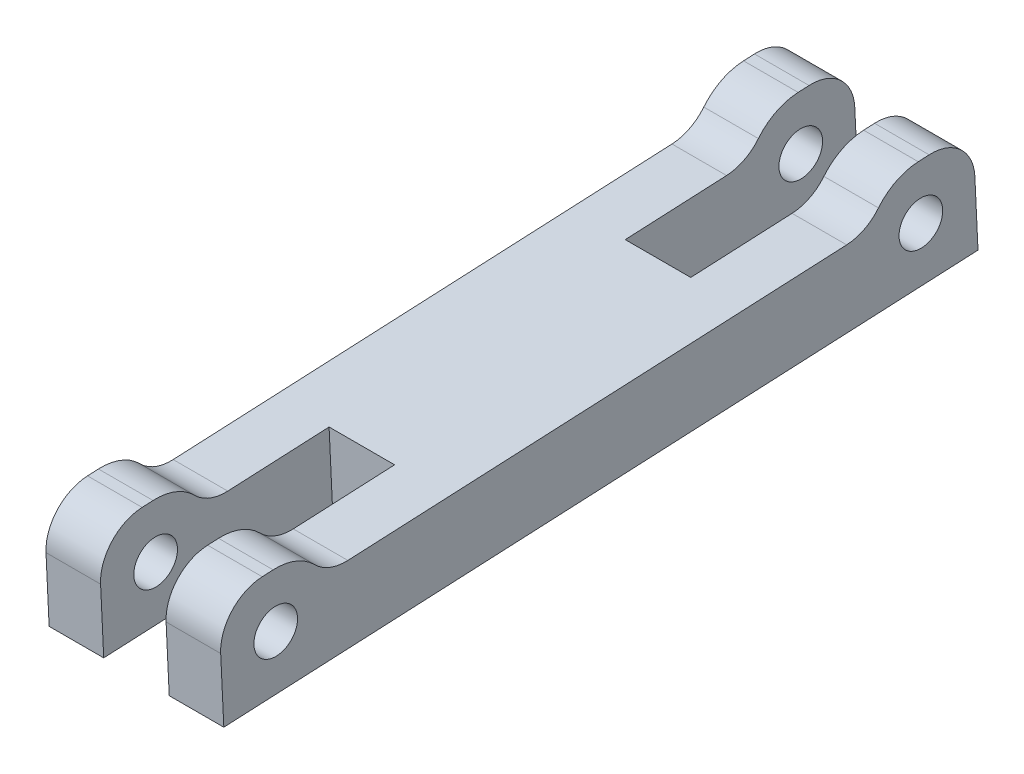
ISO-10303-21;
HEADER;
FILE_DESCRIPTION(('STEP AP214'),'2;1');
FILE_NAME('part.step','',(''),(''),'','','');
FILE_SCHEMA(('AUTOMOTIVE_DESIGN { 1 0 10303 214 1 1 1 1 }'));
ENDSEC;
DATA;
#1=APPLICATION_CONTEXT('core data for automotive mechanical design processes');
#2=APPLICATION_PROTOCOL_DEFINITION('international standard','automotive_design',2000,#1);
#3=PRODUCT_CONTEXT('',#1,'mechanical');
#4=PRODUCT('Part','Part','',(#3));
#5=PRODUCT_RELATED_PRODUCT_CATEGORY('part','',(#4));
#6=PRODUCT_DEFINITION_FORMATION('','',#4);
#7=PRODUCT_DEFINITION_CONTEXT('part definition',#1,'design');
#8=PRODUCT_DEFINITION('design','',#6,#7);
#9=PRODUCT_DEFINITION_SHAPE('','',#8);
#10=(LENGTH_UNIT() NAMED_UNIT(*) SI_UNIT(.MILLI.,.METRE.));
#11=(NAMED_UNIT(*) PLANE_ANGLE_UNIT() SI_UNIT($,.RADIAN.));
#12=(NAMED_UNIT(*) SI_UNIT($,.STERADIAN.) SOLID_ANGLE_UNIT());
#13=UNCERTAINTY_MEASURE_WITH_UNIT(LENGTH_MEASURE(1.E-05),#10,'distance_accuracy_value','');
#14=(GEOMETRIC_REPRESENTATION_CONTEXT(3) GLOBAL_UNCERTAINTY_ASSIGNED_CONTEXT((#13)) GLOBAL_UNIT_ASSIGNED_CONTEXT((#10,
#11,#12)) REPRESENTATION_CONTEXT('',''));
#15=CARTESIAN_POINT('',(0.,0.,0.));
#16=DIRECTION('',(0.,0.,1.));
#17=DIRECTION('',(1.,0.,0.));
#18=AXIS2_PLACEMENT_3D('',#15,#16,#17);
#19=CARTESIAN_POINT('',(-1.5,9.2143415885929,0.441069342239072));
#20=DIRECTION('',(0.,-0.998856306678686,-0.0478129543974714));
#21=DIRECTION('',(0.,0.0478129543974714,-0.998856306678686));
#22=AXIS2_PLACEMENT_3D('',#19,#20,#21);
#23=PLANE('',#22);
#24=DIRECTION('',(1.,0.,0.));
#25=VECTOR('',#24,1.);
#26=CARTESIAN_POINT('',(-4.,9.56820857856218,-6.95153542587181));
#27=LINE('',#26,#25);
#28=CARTESIAN_POINT('',(-4.,9.56820857856218,-6.95153542587181));
#29=VERTEX_POINT('',#28);
#30=CARTESIAN_POINT('',(-1.5,9.56820857856218,-6.95153542587181));
#31=VERTEX_POINT('',#30);
#32=EDGE_CURVE('E412',#29,#31,#27,.T.);
#33=ORIENTED_EDGE('',*,*,#32,.F.);
#34=DIRECTION('',(0.,0.0478129543974714,-0.998856306678686));
#35=VECTOR('',#34,1.);
#36=CARTESIAN_POINT('',(-4.,9.2143415885929,0.441069342239072));
#37=LINE('',#36,#35);
#38=CARTESIAN_POINT('',(-4.,9.54430210136344,-6.45210727253246));
#39=VERTEX_POINT('',#38);
#40=EDGE_CURVE('E440',#39,#29,#37,.T.);
#41=ORIENTED_EDGE('',*,*,#40,.F.);
#42=DIRECTION('',(1.,0.,0.));
#43=VECTOR('',#42,1.);
#44=CARTESIAN_POINT('',(-1.5,9.54430210136344,-6.45210727253246));
#45=LINE('',#44,#43);
#46=CARTESIAN_POINT('',(-1.5,9.54430210136344,-6.45210727253246));
#47=VERTEX_POINT('',#46);
#48=EDGE_CURVE('E301',#39,#47,#45,.T.);
#49=ORIENTED_EDGE('',*,*,#48,.T.);
#50=DIRECTION('',(0.,0.0478129543974714,-0.998856306678686));
#51=VECTOR('',#50,1.);
#52=CARTESIAN_POINT('',(-1.5,9.2143415885929,0.441069342239072));
#53=LINE('',#52,#51);
#54=EDGE_CURVE('E459',#47,#31,#53,.T.);
#55=ORIENTED_EDGE('',*,*,#54,.T.);
#56=EDGE_LOOP('',(#33,#41,#49,#55));
#57=FACE_BOUND('',#56,.T.);
#58=ADVANCED_FACE('F39',(#57),#23,.F.);
#59=CARTESIAN_POINT('',(1.5,9.56820857856218,-6.95153542587181));
#60=VERTEX_POINT('',#59);
#61=CARTESIAN_POINT('',(4.,9.56820857856218,-6.95153542587181));
#62=VERTEX_POINT('',#61);
#63=EDGE_CURVE('E401',#60,#62,#27,.T.);
#64=ORIENTED_EDGE('',*,*,#63,.F.);
#65=DIRECTION('',(0.,0.0478129543974714,-0.998856306678686));
#66=VECTOR('',#65,1.);
#67=CARTESIAN_POINT('',(1.5,9.2143415885929,0.441069342239072));
#68=LINE('',#67,#66);
#69=CARTESIAN_POINT('',(1.5,9.54430210136344,-6.45210727253246));
#70=VERTEX_POINT('',#69);
#71=EDGE_CURVE('E274',#70,#60,#68,.T.);
#72=ORIENTED_EDGE('',*,*,#71,.F.);
#73=DIRECTION('',(-1.,0.,0.));
#74=VECTOR('',#73,1.);
#75=CARTESIAN_POINT('',(4.,9.54430210136344,-6.45210727253246));
#76=LINE('',#75,#74);
#77=CARTESIAN_POINT('',(4.,9.54430210136344,-6.45210727253246));
#78=VERTEX_POINT('',#77);
#79=EDGE_CURVE('E306',#70,#78,#76,.F.);
#80=ORIENTED_EDGE('',*,*,#79,.T.);
#81=DIRECTION('',(0.,0.0478129543974714,-0.998856306678686));
#82=VECTOR('',#81,1.);
#83=CARTESIAN_POINT('',(4.,9.2143415885929,0.441069342239072));
#84=LINE('',#83,#82);
#85=EDGE_CURVE('E249',#78,#62,#84,.T.);
#86=ORIENTED_EDGE('',*,*,#85,.T.);
#87=EDGE_LOOP('',(#64,#72,#80,#86));
#88=FACE_BOUND('',#87,.T.);
#89=ADVANCED_FACE('F490',(#88),#23,.F.);
#90=DIRECTION('',(1.,0.,0.));
#91=VECTOR('',#90,1.);
#92=CARTESIAN_POINT('',(-4.,10.9824221409353,-36.4957489882449));
#93=LINE('',#92,#91);
#94=CARTESIAN_POINT('',(1.5,10.9824221409353,-36.4957489882449));
#95=VERTEX_POINT('',#94);
#96=CARTESIAN_POINT('',(4.,10.9824221409353,-36.4957489882449));
#97=VERTEX_POINT('',#96);
#98=EDGE_CURVE('E226',#95,#97,#93,.T.);
#99=ORIENTED_EDGE('',*,*,#98,.T.);
#100=CARTESIAN_POINT('',(4.,11.006328618134,-36.9951771415842));
#101=VERTEX_POINT('',#100);
#102=EDGE_CURVE('E238',#97,#101,#84,.T.);
#103=ORIENTED_EDGE('',*,*,#102,.T.);
#104=DIRECTION('',(-1.,0.,0.));
#105=VECTOR('',#104,1.);
#106=CARTESIAN_POINT('',(1.5,11.006328618134,-36.9951771415842));
#107=LINE('',#106,#105);
#108=CARTESIAN_POINT('',(1.5,11.006328618134,-36.9951771415842));
#109=VERTEX_POINT('',#108);
#110=EDGE_CURVE('E311',#101,#109,#107,.T.);
#111=ORIENTED_EDGE('',*,*,#110,.T.);
#112=EDGE_CURVE('E240',#95,#109,#68,.T.);
#113=ORIENTED_EDGE('',*,*,#112,.F.);
#114=EDGE_LOOP('',(#99,#103,#111,#113));
#115=FACE_BOUND('',#114,.T.);
#116=ADVANCED_FACE('F236',(#115),#23,.F.);
#117=CARTESIAN_POINT('',(-4.,10.9824221409353,-36.4957489882449));
#118=VERTEX_POINT('',#117);
#119=CARTESIAN_POINT('',(-1.5,10.9824221409353,-36.4957489882449));
#120=VERTEX_POINT('',#119);
#121=EDGE_CURVE('E241',#118,#120,#93,.T.);
#122=ORIENTED_EDGE('',*,*,#121,.T.);
#123=CARTESIAN_POINT('',(-1.5,11.006328618134,-36.9951771415842));
#124=VERTEX_POINT('',#123);
#125=EDGE_CURVE('E458',#120,#124,#53,.T.);
#126=ORIENTED_EDGE('',*,*,#125,.T.);
#127=DIRECTION('',(1.,0.,0.));
#128=VECTOR('',#127,1.);
#129=CARTESIAN_POINT('',(-1.5,11.006328618134,-36.9951771415842));
#130=LINE('',#129,#128);
#131=CARTESIAN_POINT('',(-4.,11.006328618134,-36.9951771415842));
#132=VERTEX_POINT('',#131);
#133=EDGE_CURVE('E308',#124,#132,#130,.F.);
#134=ORIENTED_EDGE('',*,*,#133,.T.);
#135=EDGE_CURVE('E439',#118,#132,#37,.T.);
#136=ORIENTED_EDGE('',*,*,#135,.F.);
#137=EDGE_LOOP('',(#122,#126,#134,#136));
#138=FACE_BOUND('',#137,.T.);
#139=ADVANCED_FACE('F497',(#138),#23,.F.);
#140=CARTESIAN_POINT('',(4.,0.,0.));
#141=DIRECTION('',(1.,0.,0.));
#142=DIRECTION('',(0.,0.,-1.));
#143=AXIS2_PLACEMENT_3D('',#140,#141,#142);
#144=PLANE('',#143);
#145=CARTESIAN_POINT('',(4.,7.07106781186546,-7.07106781186549));
#146=DIRECTION('',(1.,0.,0.));
#147=DIRECTION('',(0.,0.,-1.));
#148=AXIS2_PLACEMENT_3D('',#145,#146,#147);
#149=CIRCLE('',#148,1.);
#150=CARTESIAN_POINT('',(4.,7.07106781186546,-8.07106781186549));
#151=VERTEX_POINT('',#150);
#152=EDGE_CURVE('E283',#151,#151,#149,.T.);
#153=ORIENTED_EDGE('',*,*,#152,.F.);
#154=EDGE_LOOP('',(#153));
#155=FACE_BOUND('',#154,.T.);
#156=CARTESIAN_POINT('',(4.,8.48528137423855,-36.6152813742386));
#157=DIRECTION('',(1.,0.,0.));
#158=DIRECTION('',(0.,0.,-1.));
#159=AXIS2_PLACEMENT_3D('',#156,#157,#158);
#160=CIRCLE('',#159,0.999999999999998);
#161=CARTESIAN_POINT('',(4.,8.48528137423855,-37.6152813742386));
#162=VERTEX_POINT('',#161);
#163=EDGE_CURVE('E260',#162,#162,#160,.T.);
#164=ORIENTED_EDGE('',*,*,#163,.F.);
#165=EDGE_LOOP('',(#164));
#166=FACE_BOUND('',#165,.T.);
#167=ORIENTED_EDGE('',*,*,#102,.F.);
#168=CARTESIAN_POINT('',(4.,8.48528137423855,-36.6152813742386));
#169=DIRECTION('',(1.,0.,0.));
#170=DIRECTION('',(0.,0.,-1.));
#171=AXIS2_PLACEMENT_3D('',#168,#169,#170);
#172=CIRCLE('',#171,2.5);
#173=CARTESIAN_POINT('',(4.,10.0609477051715,-34.6743342823362));
#174=VERTEX_POINT('',#173);
#175=EDGE_CURVE('E222',#97,#174,#172,.T.);
#176=ORIENTED_EDGE('',*,*,#175,.T.);
#177=CARTESIAN_POINT('',(4.,11.3214807699179,-33.1215766088143));
#178=DIRECTION('',(1.,0.,0.));
#179=DIRECTION('',(0.,0.,-1.));
#180=AXIS2_PLACEMENT_3D('',#177,#178,#179);
#181=CIRCLE('',#180,2.);
#182=CARTESIAN_POINT('',(4.,9.3237681565605,-33.2172025176093));
#183=VERTEX_POINT('',#182);
#184=EDGE_CURVE('E362',#174,#183,#181,.F.);
#185=ORIENTED_EDGE('',*,*,#184,.T.);
#186=DIRECTION('',(0.,0.0478129543974721,-0.998856306678686));
#187=VECTOR('',#186,1.);
#188=CARTESIAN_POINT('',(4.,7.71605712857487,0.36934991064287));
#189=LINE('',#188,#187);
#190=CARTESIAN_POINT('',(4.,8.23029364290092,-10.3735207596999));
#191=VERTEX_POINT('',#190);
#192=EDGE_CURVE('E397',#191,#183,#189,.T.);
#193=ORIENTED_EDGE('',*,*,#192,.F.);
#194=CARTESIAN_POINT('',(4.,10.2280062562583,-10.2778948509049));
#195=DIRECTION('',(1.,0.,0.));
#196=DIRECTION('',(0.,0.,-1.));
#197=AXIS2_PLACEMENT_3D('',#194,#195,#196);
#198=CIRCLE('',#197,2.);
#199=CARTESIAN_POINT('',(4.,8.82492250319481,-8.85263838910963));
#200=VERTEX_POINT('',#199);
#201=EDGE_CURVE('E370',#191,#200,#198,.F.);
#202=ORIENTED_EDGE('',*,*,#201,.T.);
#203=CARTESIAN_POINT('',(4.,7.07106781186546,-7.07106781186549));
#204=DIRECTION('',(1.,0.,0.));
#205=DIRECTION('',(0.,0.,-1.));
#206=AXIS2_PLACEMENT_3D('',#203,#204,#205);
#207=CIRCLE('',#206,2.5);
#208=EDGE_CURVE('E232',#200,#62,#207,.T.);
#209=ORIENTED_EDGE('',*,*,#208,.T.);
#210=ORIENTED_EDGE('',*,*,#85,.F.);
#211=CARTESIAN_POINT('',(4.,7.54658948800607,-6.54773318132741));
#212=DIRECTION('',(1.,0.,0.));
#213=DIRECTION('',(0.,0.,-1.));
#214=AXIS2_PLACEMENT_3D('',#211,#212,#213);
#215=CIRCLE('',#214,2.);
#216=CARTESIAN_POINT('',(4.,7.45096357921113,-4.55002056797003));
#217=VERTEX_POINT('',#216);
#218=EDGE_CURVE('E317',#78,#217,#215,.T.);
#219=ORIENTED_EDGE('',*,*,#218,.T.);
#220=DIRECTION('',(0.,0.998856306678686,0.0478129543974701));
#221=VECTOR('',#220,1.);
#222=CARTESIAN_POINT('',(4.,0.234334603975591,-4.89546400141415));
#223=LINE('',#222,#221);
#224=CARTESIAN_POINT('',(4.,4.45439465917507,-4.69345943116244));
#225=VERTEX_POINT('',#224);
#226=EDGE_CURVE('E253',#225,#217,#223,.T.);
#227=ORIENTED_EDGE('',*,*,#226,.F.);
#228=DIRECTION('',(0.,-0.0478129543974714,0.998856306678686));
#229=VECTOR('',#228,1.);
#230=CARTESIAN_POINT('',(4.,4.22006005519947,0.202004570251715));
#231=LINE('',#230,#229);
#232=CARTESIAN_POINT('',(4.,6.10767299353553,-39.231954526929));
#233=VERTEX_POINT('',#232);
#234=EDGE_CURVE('E254',#233,#225,#231,.T.);
#235=ORIENTED_EDGE('',*,*,#234,.F.);
#236=DIRECTION('',(0.,-0.998856306678686,-0.047812954397472));
#237=VECTOR('',#236,1.);
#238=CARTESIAN_POINT('',(4.,1.88761293833608,-39.4339590971807));
#239=LINE('',#238,#237);
#240=CARTESIAN_POINT('',(4.,9.10424191357159,-39.0885156637366));
#241=VERTEX_POINT('',#240);
#242=EDGE_CURVE('E250',#241,#233,#239,.T.);
#243=ORIENTED_EDGE('',*,*,#242,.F.);
#244=CARTESIAN_POINT('',(4.,9.00861600477664,-37.0908030503792));
#245=DIRECTION('',(1.,0.,0.));
#246=DIRECTION('',(0.,0.,-1.));
#247=AXIS2_PLACEMENT_3D('',#244,#245,#246);
#248=CIRCLE('',#247,2.);
#249=EDGE_CURVE('E247',#241,#101,#248,.T.);
#250=ORIENTED_EDGE('',*,*,#249,.T.);
#251=EDGE_LOOP('',(#167,#176,#185,#193,#202,#209,#210,#219,#227,#235,#243,#250));
#252=FACE_BOUND('',#251,.T.);
#253=ADVANCED_FACE('F244',(#155,#166,#252),#144,.T.);
#254=CARTESIAN_POINT('',(1.5,0.,0.));
#255=DIRECTION('',(1.,0.,0.));
#256=DIRECTION('',(0.,0.,-1.));
#257=AXIS2_PLACEMENT_3D('',#254,#255,#256);
#258=PLANE('',#257);
#259=CARTESIAN_POINT('',(1.5,8.48528137423855,-36.6152813742386));
#260=DIRECTION('',(1.,0.,0.));
#261=DIRECTION('',(0.,0.,-1.));
#262=AXIS2_PLACEMENT_3D('',#259,#260,#261);
#263=CIRCLE('',#262,0.999999999999998);
#264=CARTESIAN_POINT('',(1.5,8.48528137423855,-37.6152813742386));
#265=VERTEX_POINT('',#264);
#266=EDGE_CURVE('E280',#265,#265,#263,.T.);
#267=ORIENTED_EDGE('',*,*,#266,.T.);
#268=EDGE_LOOP('',(#267));
#269=FACE_BOUND('',#268,.T.);
#270=CARTESIAN_POINT('',(1.5,8.48528137423855,-36.6152813742386));
#271=DIRECTION('',(1.,0.,0.));
#272=DIRECTION('',(0.,0.,-1.));
#273=AXIS2_PLACEMENT_3D('',#270,#271,#272);
#274=CIRCLE('',#273,2.5);
#275=CARTESIAN_POINT('',(1.5,10.0609477051715,-34.6743342823362));
#276=VERTEX_POINT('',#275);
#277=EDGE_CURVE('E391',#95,#276,#274,.T.);
#278=ORIENTED_EDGE('',*,*,#277,.F.);
#279=ORIENTED_EDGE('',*,*,#112,.T.);
#280=CARTESIAN_POINT('',(1.5,9.00861600477664,-37.0908030503792));
#281=DIRECTION('',(1.,0.,0.));
#282=DIRECTION('',(0.,0.,-1.));
#283=AXIS2_PLACEMENT_3D('',#280,#281,#282);
#284=CIRCLE('',#283,2.);
#285=CARTESIAN_POINT('',(1.5,9.10424191357159,-39.0885156637366));
#286=VERTEX_POINT('',#285);
#287=EDGE_CURVE('E313',#109,#286,#284,.F.);
#288=ORIENTED_EDGE('',*,*,#287,.T.);
#289=DIRECTION('',(0.,-0.998856306678686,-0.047812954397472));
#290=VECTOR('',#289,1.);
#291=CARTESIAN_POINT('',(1.5,1.88761293833608,-39.4339590971807));
#292=LINE('',#291,#290);
#293=CARTESIAN_POINT('',(1.5,6.10767299353553,-39.231954526929));
#294=VERTEX_POINT('',#293);
#295=EDGE_CURVE('E272',#286,#294,#292,.T.);
#296=ORIENTED_EDGE('',*,*,#295,.T.);
#297=DIRECTION('',(0.,-0.0478129543974714,0.998856306678686));
#298=VECTOR('',#297,1.);
#299=CARTESIAN_POINT('',(1.5,4.22006005519947,0.202004570251715));
#300=LINE('',#299,#298);
#301=CARTESIAN_POINT('',(1.5,5.60563697236208,-28.7439633068028));
#302=VERTEX_POINT('',#301);
#303=EDGE_CURVE('E269',#294,#302,#300,.T.);
#304=ORIENTED_EDGE('',*,*,#303,.T.);
#305=DIRECTION('',(0.,-0.998856306678686,-0.0478129543974714));
#306=VECTOR('',#305,1.);
#307=CARTESIAN_POINT('',(1.5,1.3855769171626,-28.9459678770545));
#308=LINE('',#307,#306);
#309=CARTESIAN_POINT('',(1.5,9.10163404573749,-28.5766179664116));
#310=VERTEX_POINT('',#309);
#311=EDGE_CURVE('E289',#310,#302,#308,.T.);
#312=ORIENTED_EDGE('',*,*,#311,.F.);
#313=DIRECTION('',(0.,0.0478129543974721,-0.998856306678686));
#314=VECTOR('',#313,1.);
#315=CARTESIAN_POINT('',(1.5,7.71605712857487,0.36934991064287));
#316=LINE('',#315,#314);
#317=CARTESIAN_POINT('',(1.5,9.3237681565605,-33.2172025176093));
#318=VERTEX_POINT('',#317);
#319=EDGE_CURVE('E419',#310,#318,#316,.T.);
#320=ORIENTED_EDGE('',*,*,#319,.T.);
#321=CARTESIAN_POINT('',(1.5,11.3214807699179,-33.1215766088143));
#322=DIRECTION('',(1.,0.,0.));
#323=DIRECTION('',(0.,0.,-1.));
#324=AXIS2_PLACEMENT_3D('',#321,#322,#323);
#325=CIRCLE('',#324,2.);
#326=EDGE_CURVE('E364',#318,#276,#325,.T.);
#327=ORIENTED_EDGE('',*,*,#326,.T.);
#328=EDGE_LOOP('',(#278,#279,#288,#296,#304,#312,#320,#327));
#329=FACE_BOUND('',#328,.T.);
#330=ADVANCED_FACE('F595',(#269,#329),#258,.F.);
#331=CARTESIAN_POINT('',(-4.,0.,0.));
#332=DIRECTION('',(1.,0.,0.));
#333=DIRECTION('',(0.,0.,-1.));
#334=AXIS2_PLACEMENT_3D('',#331,#332,#333);
#335=PLANE('',#334);
#336=CARTESIAN_POINT('',(-4.,8.48528137423855,-36.6152813742386));
#337=DIRECTION('',(1.,0.,0.));
#338=DIRECTION('',(0.,0.,-1.));
#339=AXIS2_PLACEMENT_3D('',#336,#337,#338);
#340=CIRCLE('',#339,0.999999999999998);
#341=CARTESIAN_POINT('',(-4.,8.48528137423855,-37.6152813742386));
#342=VERTEX_POINT('',#341);
#343=EDGE_CURVE('E446',#342,#342,#340,.T.);
#344=ORIENTED_EDGE('',*,*,#343,.T.);
#345=EDGE_LOOP('',(#344));
#346=FACE_BOUND('',#345,.T.);
#347=CARTESIAN_POINT('',(-4.,7.07106781186546,-7.07106781186549));
#348=DIRECTION('',(1.,0.,0.));
#349=DIRECTION('',(0.,0.,-1.));
#350=AXIS2_PLACEMENT_3D('',#347,#348,#349);
#351=CIRCLE('',#350,1.);
#352=CARTESIAN_POINT('',(-4.,7.07106781186546,-8.07106781186549));
#353=VERTEX_POINT('',#352);
#354=EDGE_CURVE('E430',#353,#353,#351,.T.);
#355=ORIENTED_EDGE('',*,*,#354,.T.);
#356=EDGE_LOOP('',(#355));
#357=FACE_BOUND('',#356,.T.);
#358=CARTESIAN_POINT('',(-4.,8.48528137423855,-36.6152813742386));
#359=DIRECTION('',(1.,0.,0.));
#360=DIRECTION('',(0.,0.,-1.));
#361=AXIS2_PLACEMENT_3D('',#358,#359,#360);
#362=CIRCLE('',#361,2.5);
#363=CARTESIAN_POINT('',(-4.,10.0609477051715,-34.6743342823362));
#364=VERTEX_POINT('',#363);
#365=EDGE_CURVE('E403',#118,#364,#362,.T.);
#366=ORIENTED_EDGE('',*,*,#365,.F.);
#367=ORIENTED_EDGE('',*,*,#135,.T.);
#368=CARTESIAN_POINT('',(-4.,9.00861600477664,-37.0908030503792));
#369=DIRECTION('',(1.,0.,0.));
#370=DIRECTION('',(0.,0.,-1.));
#371=AXIS2_PLACEMENT_3D('',#368,#369,#370);
#372=CIRCLE('',#371,2.);
#373=CARTESIAN_POINT('',(-4.,9.10424191357159,-39.0885156637366));
#374=VERTEX_POINT('',#373);
#375=EDGE_CURVE('E328',#132,#374,#372,.F.);
#376=ORIENTED_EDGE('',*,*,#375,.T.);
#377=DIRECTION('',(0.,-0.998856306678686,-0.047812954397472));
#378=VECTOR('',#377,1.);
#379=CARTESIAN_POINT('',(-4.,1.88761293833608,-39.4339590971807));
#380=LINE('',#379,#378);
#381=CARTESIAN_POINT('',(-4.,6.10767299353553,-39.231954526929));
#382=VERTEX_POINT('',#381);
#383=EDGE_CURVE('E437',#374,#382,#380,.T.);
#384=ORIENTED_EDGE('',*,*,#383,.T.);
#385=DIRECTION('',(0.,-0.0478129543974714,0.998856306678686));
#386=VECTOR('',#385,1.);
#387=CARTESIAN_POINT('',(-4.,4.22006005519947,0.202004570251715));
#388=LINE('',#387,#386);
#389=CARTESIAN_POINT('',(-4.,4.45439465917507,-4.69345943116244));
#390=VERTEX_POINT('',#389);
#391=EDGE_CURVE('E433',#382,#390,#388,.T.);
#392=ORIENTED_EDGE('',*,*,#391,.T.);
#393=DIRECTION('',(0.,0.998856306678686,0.0478129543974701));
#394=VECTOR('',#393,1.);
#395=CARTESIAN_POINT('',(-4.,0.234334603975591,-4.89546400141415));
#396=LINE('',#395,#394);
#397=CARTESIAN_POINT('',(-4.,7.45096357921113,-4.55002056797003));
#398=VERTEX_POINT('',#397);
#399=EDGE_CURVE('E443',#390,#398,#396,.T.);
#400=ORIENTED_EDGE('',*,*,#399,.T.);
#401=CARTESIAN_POINT('',(-4.,7.54658948800607,-6.54773318132741));
#402=DIRECTION('',(1.,0.,0.));
#403=DIRECTION('',(0.,0.,-1.));
#404=AXIS2_PLACEMENT_3D('',#401,#402,#403);
#405=CIRCLE('',#404,2.);
#406=EDGE_CURVE('E326',#398,#39,#405,.F.);
#407=ORIENTED_EDGE('',*,*,#406,.T.);
#408=ORIENTED_EDGE('',*,*,#40,.T.);
#409=CARTESIAN_POINT('',(-4.,7.07106781186546,-7.07106781186549));
#410=DIRECTION('',(1.,0.,0.));
#411=DIRECTION('',(0.,0.,-1.));
#412=AXIS2_PLACEMENT_3D('',#409,#410,#411);
#413=CIRCLE('',#412,2.5);
#414=CARTESIAN_POINT('',(-4.,8.82492250319481,-8.85263838910963));
#415=VERTEX_POINT('',#414);
#416=EDGE_CURVE('E408',#415,#29,#413,.T.);
#417=ORIENTED_EDGE('',*,*,#416,.F.);
#418=CARTESIAN_POINT('',(-4.,10.2280062562583,-10.2778948509049));
#419=DIRECTION('',(1.,0.,0.));
#420=DIRECTION('',(0.,0.,-1.));
#421=AXIS2_PLACEMENT_3D('',#418,#419,#420);
#422=CIRCLE('',#421,2.);
#423=CARTESIAN_POINT('',(-4.,8.23029364290092,-10.3735207596999));
#424=VERTEX_POINT('',#423);
#425=EDGE_CURVE('E11',#415,#424,#422,.T.);
#426=ORIENTED_EDGE('',*,*,#425,.T.);
#427=DIRECTION('',(0.,0.0478129543974721,-0.998856306678686));
#428=VECTOR('',#427,1.);
#429=CARTESIAN_POINT('',(-4.,7.71605712857487,0.36934991064287));
#430=LINE('',#429,#428);
#431=CARTESIAN_POINT('',(-4.,9.3237681565605,-33.2172025176093));
#432=VERTEX_POINT('',#431);
#433=EDGE_CURVE('E242',#424,#432,#430,.T.);
#434=ORIENTED_EDGE('',*,*,#433,.T.);
#435=CARTESIAN_POINT('',(-4.,11.3214807699179,-33.1215766088143));
#436=DIRECTION('',(1.,0.,0.));
#437=DIRECTION('',(0.,0.,-1.));
#438=AXIS2_PLACEMENT_3D('',#435,#436,#437);
#439=CIRCLE('',#438,2.);
#440=EDGE_CURVE('E368',#432,#364,#439,.T.);
#441=ORIENTED_EDGE('',*,*,#440,.T.);
#442=EDGE_LOOP('',(#366,#367,#376,#384,#392,#400,#407,#408,#417,#426,#434,#441));
#443=FACE_BOUND('',#442,.T.);
#444=ADVANCED_FACE('F545',(#346,#357,#443),#335,.F.);
#445=CARTESIAN_POINT('',(-1.5,0.,0.));
#446=DIRECTION('',(1.,0.,0.));
#447=DIRECTION('',(0.,0.,-1.));
#448=AXIS2_PLACEMENT_3D('',#445,#446,#447);
#449=PLANE('',#448);
#450=CARTESIAN_POINT('',(-1.5,8.48528137423855,-36.6152813742386));
#451=DIRECTION('',(1.,0.,0.));
#452=DIRECTION('',(0.,0.,-1.));
#453=AXIS2_PLACEMENT_3D('',#450,#451,#452);
#454=CIRCLE('',#453,0.999999999999998);
#455=CARTESIAN_POINT('',(-1.5,8.48528137423855,-37.6152813742386));
#456=VERTEX_POINT('',#455);
#457=EDGE_CURVE('E434',#456,#456,#454,.T.);
#458=ORIENTED_EDGE('',*,*,#457,.F.);
#459=EDGE_LOOP('',(#458));
#460=FACE_BOUND('',#459,.T.);
#461=ORIENTED_EDGE('',*,*,#125,.F.);
#462=CARTESIAN_POINT('',(-1.5,8.48528137423855,-36.6152813742386));
#463=DIRECTION('',(1.,0.,0.));
#464=DIRECTION('',(0.,0.,-1.));
#465=AXIS2_PLACEMENT_3D('',#462,#463,#464);
#466=CIRCLE('',#465,2.5);
#467=CARTESIAN_POINT('',(-1.5,10.0609477051715,-34.6743342823362));
#468=VERTEX_POINT('',#467);
#469=EDGE_CURVE('E342',#120,#468,#466,.T.);
#470=ORIENTED_EDGE('',*,*,#469,.T.);
#471=CARTESIAN_POINT('',(-1.5,11.3214807699179,-33.1215766088143));
#472=DIRECTION('',(1.,0.,0.));
#473=DIRECTION('',(0.,0.,-1.));
#474=AXIS2_PLACEMENT_3D('',#471,#472,#473);
#475=CIRCLE('',#474,2.);
#476=CARTESIAN_POINT('',(-1.5,9.3237681565605,-33.2172025176093));
#477=VERTEX_POINT('',#476);
#478=EDGE_CURVE('E366',#468,#477,#475,.F.);
#479=ORIENTED_EDGE('',*,*,#478,.T.);
#480=DIRECTION('',(0.,0.0478129543974721,-0.998856306678686));
#481=VECTOR('',#480,1.);
#482=CARTESIAN_POINT('',(-1.5,7.71605712857487,0.36934991064287));
#483=LINE('',#482,#481);
#484=CARTESIAN_POINT('',(-1.5,9.10163404573749,-28.5766179664116));
#485=VERTEX_POINT('',#484);
#486=EDGE_CURVE('E339',#485,#477,#483,.T.);
#487=ORIENTED_EDGE('',*,*,#486,.F.);
#488=DIRECTION('',(0.,-0.998856306678686,-0.0478129543974714));
#489=VECTOR('',#488,1.);
#490=CARTESIAN_POINT('',(-1.5,1.3855769171626,-28.9459678770545));
#491=LINE('',#490,#489);
#492=CARTESIAN_POINT('',(-1.5,5.60563697236208,-28.7439633068028));
#493=VERTEX_POINT('',#492);
#494=EDGE_CURVE('E293',#485,#493,#491,.T.);
#495=ORIENTED_EDGE('',*,*,#494,.T.);
#496=DIRECTION('',(0.,-0.0478129543974714,0.998856306678686));
#497=VECTOR('',#496,1.);
#498=CARTESIAN_POINT('',(-1.5,4.22006005519947,0.202004570251715));
#499=LINE('',#498,#497);
#500=CARTESIAN_POINT('',(-1.5,6.10767299353553,-39.231954526929));
#501=VERTEX_POINT('',#500);
#502=EDGE_CURVE('E453',#501,#493,#499,.T.);
#503=ORIENTED_EDGE('',*,*,#502,.F.);
#504=DIRECTION('',(0.,-0.998856306678686,-0.047812954397472));
#505=VECTOR('',#504,1.);
#506=CARTESIAN_POINT('',(-1.5,1.88761293833608,-39.4339590971807));
#507=LINE('',#506,#505);
#508=CARTESIAN_POINT('',(-1.5,9.10424191357159,-39.0885156637366));
#509=VERTEX_POINT('',#508);
#510=EDGE_CURVE('E456',#509,#501,#507,.T.);
#511=ORIENTED_EDGE('',*,*,#510,.F.);
#512=CARTESIAN_POINT('',(-1.5,9.00861600477664,-37.0908030503792));
#513=DIRECTION('',(1.,0.,0.));
#514=DIRECTION('',(0.,0.,-1.));
#515=AXIS2_PLACEMENT_3D('',#512,#513,#514);
#516=CIRCLE('',#515,2.);
#517=EDGE_CURVE('E323',#509,#124,#516,.T.);
#518=ORIENTED_EDGE('',*,*,#517,.T.);
#519=EDGE_LOOP('',(#461,#470,#479,#487,#495,#503,#511,#518));
#520=FACE_BOUND('',#519,.T.);
#521=ADVANCED_FACE('F509',(#460,#520),#449,.T.);
#522=CARTESIAN_POINT('',(-1.5,4.22006005519947,0.202004570251715));
#523=DIRECTION('',(0.,0.998856306678686,0.0478129543974714));
#524=DIRECTION('',(0.,-0.0478129543974714,0.998856306678686));
#525=AXIS2_PLACEMENT_3D('',#522,#523,#524);
#526=PLANE('',#525);
#527=DIRECTION('',(1.,0.,0.));
#528=VECTOR('',#527,1.);
#529=CARTESIAN_POINT('',(-1.5,5.60563697236208,-28.7439633068028));
#530=LINE('',#529,#528);
#531=EDGE_CURVE('E297',#493,#302,#530,.T.);
#532=ORIENTED_EDGE('',*,*,#531,.T.);
#533=ORIENTED_EDGE('',*,*,#303,.F.);
#534=DIRECTION('',(-1.,0.,0.));
#535=VECTOR('',#534,1.);
#536=CARTESIAN_POINT('',(4.,6.10767299353553,-39.231954526929));
#537=LINE('',#536,#535);
#538=EDGE_CURVE('E286',#233,#294,#537,.T.);
#539=ORIENTED_EDGE('',*,*,#538,.F.);
#540=ORIENTED_EDGE('',*,*,#234,.T.);
#541=DIRECTION('',(-1.,0.,0.));
#542=VECTOR('',#541,1.);
#543=CARTESIAN_POINT('',(4.,4.45439465917507,-4.69345943116244));
#544=LINE('',#543,#542);
#545=CARTESIAN_POINT('',(1.5,4.45439465917507,-4.69345943116244));
#546=VERTEX_POINT('',#545);
#547=EDGE_CURVE('E263',#225,#546,#544,.T.);
#548=ORIENTED_EDGE('',*,*,#547,.T.);
#549=CARTESIAN_POINT('',(1.5,4.95643068034852,-15.1814506512887));
#550=VERTEX_POINT('',#549);
#551=EDGE_CURVE('E267',#550,#546,#300,.T.);
#552=ORIENTED_EDGE('',*,*,#551,.F.);
#553=DIRECTION('',(1.,0.,0.));
#554=VECTOR('',#553,1.);
#555=CARTESIAN_POINT('',(-1.5,4.95643068034852,-15.1814506512887));
#556=LINE('',#555,#554);
#557=CARTESIAN_POINT('',(-1.5,4.95643068034852,-15.1814506512887));
#558=VERTEX_POINT('',#557);
#559=EDGE_CURVE('E298',#558,#550,#556,.T.);
#560=ORIENTED_EDGE('',*,*,#559,.F.);
#561=CARTESIAN_POINT('',(-1.5,4.45439465917507,-4.69345943116244));
#562=VERTEX_POINT('',#561);
#563=EDGE_CURVE('E452',#558,#562,#499,.T.);
#564=ORIENTED_EDGE('',*,*,#563,.T.);
#565=DIRECTION('',(1.,0.,0.));
#566=VECTOR('',#565,1.);
#567=CARTESIAN_POINT('',(-4.,4.45439465917507,-4.69345943116244));
#568=LINE('',#567,#566);
#569=EDGE_CURVE('E268',#390,#562,#568,.T.);
#570=ORIENTED_EDGE('',*,*,#569,.F.);
#571=ORIENTED_EDGE('',*,*,#391,.F.);
#572=DIRECTION('',(1.,0.,0.));
#573=VECTOR('',#572,1.);
#574=CARTESIAN_POINT('',(-4.,6.10767299353553,-39.231954526929));
#575=LINE('',#574,#573);
#576=EDGE_CURVE('E449',#382,#501,#575,.T.);
#577=ORIENTED_EDGE('',*,*,#576,.T.);
#578=ORIENTED_EDGE('',*,*,#502,.T.);
#579=EDGE_LOOP('',(#532,#533,#539,#540,#548,#552,#560,#564,#570,#571,#577,#578));
#580=FACE_BOUND('',#579,.T.);
#581=ADVANCED_FACE('F477',(#580),#526,.F.);
#582=CARTESIAN_POINT('',(-1.5,0.736370625149048,-15.3834552215404));
#583=DIRECTION('',(0.,-0.0478129543974714,0.998856306678686));
#584=DIRECTION('',(0.,-0.998856306678686,-0.0478129543974714));
#585=AXIS2_PLACEMENT_3D('',#582,#583,#584);
#586=PLANE('',#585);
#587=DIRECTION('',(1.,0.,0.));
#588=VECTOR('',#587,1.);
#589=CARTESIAN_POINT('',(-1.5,8.45242775372393,-15.0141053108975));
#590=LINE('',#589,#588);
#591=CARTESIAN_POINT('',(-1.5,8.45242775372392,-15.0141053108975));
#592=VERTEX_POINT('',#591);
#593=CARTESIAN_POINT('',(1.5,8.45242775372393,-15.0141053108975));
#594=VERTEX_POINT('',#593);
#595=EDGE_CURVE('E389',#592,#594,#590,.T.);
#596=ORIENTED_EDGE('',*,*,#595,.F.);
#597=DIRECTION('',(0.,-0.998856306678686,-0.0478129543974714));
#598=VECTOR('',#597,1.);
#599=CARTESIAN_POINT('',(-1.5,0.736370625149048,-15.3834552215404));
#600=LINE('',#599,#598);
#601=EDGE_CURVE('E295',#592,#558,#600,.T.);
#602=ORIENTED_EDGE('',*,*,#601,.T.);
#603=ORIENTED_EDGE('',*,*,#559,.T.);
#604=DIRECTION('',(0.,-0.998856306678686,-0.0478129543974714));
#605=VECTOR('',#604,1.);
#606=CARTESIAN_POINT('',(1.5,0.736370625149048,-15.3834552215404));
#607=LINE('',#606,#605);
#608=EDGE_CURVE('E291',#594,#550,#607,.T.);
#609=ORIENTED_EDGE('',*,*,#608,.F.);
#610=EDGE_LOOP('',(#596,#602,#603,#609));
#611=FACE_BOUND('',#610,.T.);
#612=ADVANCED_FACE('F501',(#611),#586,.T.);
#613=CARTESIAN_POINT('',(-1.5,1.3855769171626,-28.9459678770545));
#614=DIRECTION('',(0.,-0.0478129543974714,0.998856306678686));
#615=DIRECTION('',(0.,-0.998856306678686,-0.0478129543974714));
#616=AXIS2_PLACEMENT_3D('',#613,#614,#615);
#617=PLANE('',#616);
#618=ORIENTED_EDGE('',*,*,#494,.F.);
#619=DIRECTION('',(1.,0.,0.));
#620=VECTOR('',#619,1.);
#621=CARTESIAN_POINT('',(-1.5,9.10163404573749,-28.5766179664116));
#622=LINE('',#621,#620);
#623=EDGE_CURVE('E414',#485,#310,#622,.T.);
#624=ORIENTED_EDGE('',*,*,#623,.T.);
#625=ORIENTED_EDGE('',*,*,#311,.T.);
#626=ORIENTED_EDGE('',*,*,#531,.F.);
#627=EDGE_LOOP('',(#618,#624,#625,#626));
#628=FACE_BOUND('',#627,.T.);
#629=ADVANCED_FACE('F503',(#628),#617,.F.);
#630=CARTESIAN_POINT('',(1.5,7.07106781186546,-7.07106781186549));
#631=DIRECTION('',(1.,0.,0.));
#632=DIRECTION('',(0.,0.,-1.));
#633=AXIS2_PLACEMENT_3D('',#630,#631,#632);
#634=CIRCLE('',#633,1.);
#635=CARTESIAN_POINT('',(1.5,7.07106781186546,-8.07106781186549));
#636=VERTEX_POINT('',#635);
#637=EDGE_CURVE('E264',#636,#636,#634,.T.);
#638=ORIENTED_EDGE('',*,*,#637,.T.);
#639=EDGE_LOOP('',(#638));
#640=FACE_BOUND('',#639,.T.);
#641=CARTESIAN_POINT('',(1.5,7.07106781186546,-7.07106781186549));
#642=DIRECTION('',(1.,0.,0.));
#643=DIRECTION('',(0.,0.,-1.));
#644=AXIS2_PLACEMENT_3D('',#641,#642,#643);
#645=CIRCLE('',#644,2.5);
#646=CARTESIAN_POINT('',(1.5,8.82492250319481,-8.85263838910963));
#647=VERTEX_POINT('',#646);
#648=EDGE_CURVE('E380',#647,#60,#645,.T.);
#649=ORIENTED_EDGE('',*,*,#648,.F.);
#650=CARTESIAN_POINT('',(1.5,10.2280062562583,-10.2778948509049));
#651=DIRECTION('',(1.,0.,0.));
#652=DIRECTION('',(0.,0.,-1.));
#653=AXIS2_PLACEMENT_3D('',#650,#651,#652);
#654=CIRCLE('',#653,2.);
#655=CARTESIAN_POINT('',(1.5,8.23029364290092,-10.3735207596999));
#656=VERTEX_POINT('',#655);
#657=EDGE_CURVE('E372',#647,#656,#654,.T.);
#658=ORIENTED_EDGE('',*,*,#657,.T.);
#659=DIRECTION('',(0.,0.0478129543974721,-0.998856306678686));
#660=VECTOR('',#659,1.);
#661=CARTESIAN_POINT('',(1.5,7.71605712857487,0.36934991064287));
#662=LINE('',#661,#660);
#663=EDGE_CURVE('E378',#656,#594,#662,.T.);
#664=ORIENTED_EDGE('',*,*,#663,.T.);
#665=ORIENTED_EDGE('',*,*,#608,.T.);
#666=ORIENTED_EDGE('',*,*,#551,.T.);
#667=DIRECTION('',(0.,0.998856306678686,0.0478129543974701));
#668=VECTOR('',#667,1.);
#669=CARTESIAN_POINT('',(1.5,0.234334603975591,-4.89546400141415));
#670=LINE('',#669,#668);
#671=CARTESIAN_POINT('',(1.5,7.45096357921113,-4.55002056797003));
#672=VERTEX_POINT('',#671);
#673=EDGE_CURVE('E277',#546,#672,#670,.T.);
#674=ORIENTED_EDGE('',*,*,#673,.T.);
#675=CARTESIAN_POINT('',(1.5,7.54658948800607,-6.54773318132741));
#676=DIRECTION('',(1.,0.,0.));
#677=DIRECTION('',(0.,0.,-1.));
#678=AXIS2_PLACEMENT_3D('',#675,#676,#677);
#679=CIRCLE('',#678,2.);
#680=EDGE_CURVE('E333',#672,#70,#679,.F.);
#681=ORIENTED_EDGE('',*,*,#680,.T.);
#682=ORIENTED_EDGE('',*,*,#71,.T.);
#683=EDGE_LOOP('',(#649,#658,#664,#665,#666,#674,#681,#682));
#684=FACE_BOUND('',#683,.T.);
#685=ADVANCED_FACE('F377',(#640,#684),#258,.F.);
#686=CARTESIAN_POINT('',(4.,1.88761293833608,-39.4339590971807));
#687=DIRECTION('',(0.,0.047812954397472,-0.998856306678686));
#688=DIRECTION('',(0.,0.998856306678686,0.047812954397472));
#689=AXIS2_PLACEMENT_3D('',#686,#687,#688);
#690=PLANE('',#689);
#691=ORIENTED_EDGE('',*,*,#295,.F.);
#692=DIRECTION('',(-1.,0.,0.));
#693=VECTOR('',#692,1.);
#694=CARTESIAN_POINT('',(4.,9.10424191357158,-39.0885156637366));
#695=LINE('',#694,#693);
#696=EDGE_CURVE('E315',#286,#241,#695,.F.);
#697=ORIENTED_EDGE('',*,*,#696,.T.);
#698=ORIENTED_EDGE('',*,*,#242,.T.);
#699=ORIENTED_EDGE('',*,*,#538,.T.);
#700=EDGE_LOOP('',(#691,#697,#698,#699));
#701=FACE_BOUND('',#700,.T.);
#702=ADVANCED_FACE('F625',(#701),#690,.T.);
#703=CARTESIAN_POINT('',(4.,0.234334603975591,-4.89546400141415));
#704=DIRECTION('',(0.,-0.0478129543974701,0.998856306678686));
#705=DIRECTION('',(0.,-0.998856306678686,-0.0478129543974701));
#706=AXIS2_PLACEMENT_3D('',#703,#704,#705);
#707=PLANE('',#706);
#708=ORIENTED_EDGE('',*,*,#226,.T.);
#709=DIRECTION('',(-1.,0.,0.));
#710=VECTOR('',#709,1.);
#711=CARTESIAN_POINT('',(1.5,7.45096357921113,-4.55002056797003));
#712=LINE('',#711,#710);
#713=EDGE_CURVE('E330',#217,#672,#712,.T.);
#714=ORIENTED_EDGE('',*,*,#713,.T.);
#715=ORIENTED_EDGE('',*,*,#673,.F.);
#716=ORIENTED_EDGE('',*,*,#547,.F.);
#717=EDGE_LOOP('',(#708,#714,#715,#716));
#718=FACE_BOUND('',#717,.T.);
#719=ADVANCED_FACE('F484',(#718),#707,.T.);
#720=CARTESIAN_POINT('',(4.,7.07106781186546,-7.07106781186549));
#721=DIRECTION('',(-1.,0.,0.));
#722=DIRECTION('',(0.,0.,1.));
#723=AXIS2_PLACEMENT_3D('',#720,#721,#722);
#724=CYLINDRICAL_SURFACE('',#723,1.);
#725=ORIENTED_EDGE('',*,*,#152,.T.);
#726=EDGE_LOOP('',(#725));
#727=FACE_BOUND('',#726,.T.);
#728=ORIENTED_EDGE('',*,*,#637,.F.);
#729=EDGE_LOOP('',(#728));
#730=FACE_BOUND('',#729,.T.);
#731=ADVANCED_FACE('F621',(#727,#730),#724,.F.);
#732=CARTESIAN_POINT('',(4.,8.48528137423855,-36.6152813742386));
#733=DIRECTION('',(-1.,0.,0.));
#734=DIRECTION('',(0.,0.,1.));
#735=AXIS2_PLACEMENT_3D('',#732,#733,#734);
#736=CYLINDRICAL_SURFACE('',#735,0.999999999999998);
#737=ORIENTED_EDGE('',*,*,#163,.T.);
#738=EDGE_LOOP('',(#737));
#739=FACE_BOUND('',#738,.T.);
#740=ORIENTED_EDGE('',*,*,#266,.F.);
#741=EDGE_LOOP('',(#740));
#742=FACE_BOUND('',#741,.T.);
#743=ADVANCED_FACE('F618',(#739,#742),#736,.F.);
#744=DIRECTION('',(0.,0.0478129543974721,-0.998856306678686));
#745=VECTOR('',#744,1.);
#746=CARTESIAN_POINT('',(-1.5,7.71605712857487,0.36934991064287));
#747=LINE('',#746,#745);
#748=CARTESIAN_POINT('',(-1.5,8.23029364290092,-10.3735207596999));
#749=VERTEX_POINT('',#748);
#750=EDGE_CURVE('E422',#749,#592,#747,.T.);
#751=ORIENTED_EDGE('',*,*,#750,.F.);
#752=CARTESIAN_POINT('',(-1.5,10.2280062562583,-10.2778948509049));
#753=DIRECTION('',(1.,0.,0.));
#754=DIRECTION('',(0.,0.,-1.));
#755=AXIS2_PLACEMENT_3D('',#752,#753,#754);
#756=CIRCLE('',#755,2.);
#757=CARTESIAN_POINT('',(-1.5,8.82492250319481,-8.85263838910963));
#758=VERTEX_POINT('',#757);
#759=EDGE_CURVE('E47',#749,#758,#756,.F.);
#760=ORIENTED_EDGE('',*,*,#759,.T.);
#761=CARTESIAN_POINT('',(-1.5,7.07106781186546,-7.07106781186549));
#762=DIRECTION('',(1.,0.,0.));
#763=DIRECTION('',(0.,0.,-1.));
#764=AXIS2_PLACEMENT_3D('',#761,#762,#763);
#765=CIRCLE('',#764,2.5);
#766=EDGE_CURVE('E426',#758,#31,#765,.T.);
#767=ORIENTED_EDGE('',*,*,#766,.T.);
#768=ORIENTED_EDGE('',*,*,#54,.F.);
#769=CARTESIAN_POINT('',(-1.5,7.54658948800607,-6.54773318132741));
#770=DIRECTION('',(1.,0.,0.));
#771=DIRECTION('',(0.,0.,-1.));
#772=AXIS2_PLACEMENT_3D('',#769,#770,#771);
#773=CIRCLE('',#772,2.);
#774=CARTESIAN_POINT('',(-1.5,7.45096357921113,-4.55002056797003));
#775=VERTEX_POINT('',#774);
#776=EDGE_CURVE('E335',#47,#775,#773,.T.);
#777=ORIENTED_EDGE('',*,*,#776,.T.);
#778=DIRECTION('',(0.,0.998856306678686,0.0478129543974701));
#779=VECTOR('',#778,1.);
#780=CARTESIAN_POINT('',(-1.5,0.234334603975591,-4.89546400141415));
#781=LINE('',#780,#779);
#782=EDGE_CURVE('E462',#562,#775,#781,.T.);
#783=ORIENTED_EDGE('',*,*,#782,.F.);
#784=ORIENTED_EDGE('',*,*,#563,.F.);
#785=ORIENTED_EDGE('',*,*,#601,.F.);
#786=EDGE_LOOP('',(#751,#760,#767,#768,#777,#783,#784,#785));
#787=FACE_BOUND('',#786,.T.);
#788=CARTESIAN_POINT('',(-1.5,7.07106781186546,-7.07106781186549));
#789=DIRECTION('',(1.,0.,0.));
#790=DIRECTION('',(0.,0.,-1.));
#791=AXIS2_PLACEMENT_3D('',#788,#789,#790);
#792=CIRCLE('',#791,1.);
#793=CARTESIAN_POINT('',(-1.5,7.07106781186546,-8.07106781186549));
#794=VERTEX_POINT('',#793);
#795=EDGE_CURVE('E429',#794,#794,#792,.T.);
#796=ORIENTED_EDGE('',*,*,#795,.F.);
#797=EDGE_LOOP('',(#796));
#798=FACE_BOUND('',#797,.T.);
#799=ADVANCED_FACE('F574',(#787,#798),#449,.T.);
#800=CARTESIAN_POINT('',(-4.,0.234334603975591,-4.89546400141415));
#801=DIRECTION('',(0.,0.0478129543974701,-0.998856306678686));
#802=DIRECTION('',(0.,0.998856306678686,0.0478129543974701));
#803=AXIS2_PLACEMENT_3D('',#800,#801,#802);
#804=PLANE('',#803);
#805=ORIENTED_EDGE('',*,*,#782,.T.);
#806=DIRECTION('',(1.,0.,0.));
#807=VECTOR('',#806,1.);
#808=CARTESIAN_POINT('',(-4.,7.45096357921113,-4.55002056797003));
#809=LINE('',#808,#807);
#810=EDGE_CURVE('E337',#775,#398,#809,.F.);
#811=ORIENTED_EDGE('',*,*,#810,.T.);
#812=ORIENTED_EDGE('',*,*,#399,.F.);
#813=ORIENTED_EDGE('',*,*,#569,.T.);
#814=EDGE_LOOP('',(#805,#811,#812,#813));
#815=FACE_BOUND('',#814,.T.);
#816=ADVANCED_FACE('F604',(#815),#804,.F.);
#817=CARTESIAN_POINT('',(-4.,1.88761293833608,-39.4339590971807));
#818=DIRECTION('',(0.,-0.047812954397472,0.998856306678686));
#819=DIRECTION('',(0.,-0.998856306678686,-0.047812954397472));
#820=AXIS2_PLACEMENT_3D('',#817,#818,#819);
#821=PLANE('',#820);
#822=ORIENTED_EDGE('',*,*,#383,.F.);
#823=DIRECTION('',(1.,0.,0.));
#824=VECTOR('',#823,1.);
#825=CARTESIAN_POINT('',(-4.,9.10424191357158,-39.0885156637366));
#826=LINE('',#825,#824);
#827=EDGE_CURVE('E320',#374,#509,#826,.T.);
#828=ORIENTED_EDGE('',*,*,#827,.T.);
#829=ORIENTED_EDGE('',*,*,#510,.T.);
#830=ORIENTED_EDGE('',*,*,#576,.F.);
#831=EDGE_LOOP('',(#822,#828,#829,#830));
#832=FACE_BOUND('',#831,.T.);
#833=ADVANCED_FACE('F564',(#832),#821,.F.);
#834=CARTESIAN_POINT('',(-4.,7.07106781186546,-7.07106781186549));
#835=DIRECTION('',(1.,0.,0.));
#836=DIRECTION('',(0.,0.,-1.));
#837=AXIS2_PLACEMENT_3D('',#834,#835,#836);
#838=CYLINDRICAL_SURFACE('',#837,1.);
#839=ORIENTED_EDGE('',*,*,#354,.F.);
#840=EDGE_LOOP('',(#839));
#841=FACE_BOUND('',#840,.T.);
#842=ORIENTED_EDGE('',*,*,#795,.T.);
#843=EDGE_LOOP('',(#842));
#844=FACE_BOUND('',#843,.T.);
#845=ADVANCED_FACE('F602',(#841,#844),#838,.F.);
#846=CARTESIAN_POINT('',(-4.,8.48528137423855,-36.6152813742386));
#847=DIRECTION('',(1.,0.,0.));
#848=DIRECTION('',(0.,0.,-1.));
#849=AXIS2_PLACEMENT_3D('',#846,#847,#848);
#850=CYLINDRICAL_SURFACE('',#849,0.999999999999998);
#851=ORIENTED_EDGE('',*,*,#343,.F.);
#852=EDGE_LOOP('',(#851));
#853=FACE_BOUND('',#852,.T.);
#854=ORIENTED_EDGE('',*,*,#457,.T.);
#855=EDGE_LOOP('',(#854));
#856=FACE_BOUND('',#855,.T.);
#857=ADVANCED_FACE('F514',(#853,#856),#850,.F.);
#858=CARTESIAN_POINT('',(-1.5,9.00861600477664,-37.0908030503792));
#859=DIRECTION('',(1.,0.,0.));
#860=DIRECTION('',(0.,0.,-1.));
#861=AXIS2_PLACEMENT_3D('',#858,#859,#860);
#862=CYLINDRICAL_SURFACE('',#861,2.);
#863=ORIENTED_EDGE('',*,*,#249,.F.);
#864=ORIENTED_EDGE('',*,*,#696,.F.);
#865=ORIENTED_EDGE('',*,*,#287,.F.);
#866=ORIENTED_EDGE('',*,*,#110,.F.);
#867=EDGE_LOOP('',(#863,#864,#865,#866));
#868=FACE_BOUND('',#867,.T.);
#869=ADVANCED_FACE('F510',(#868),#862,.T.);
#870=CARTESIAN_POINT('',(-4.,9.00861600477664,-37.0908030503792));
#871=DIRECTION('',(1.,0.,0.));
#872=DIRECTION('',(0.,0.,-1.));
#873=AXIS2_PLACEMENT_3D('',#870,#871,#872);
#874=CYLINDRICAL_SURFACE('',#873,2.);
#875=ORIENTED_EDGE('',*,*,#375,.F.);
#876=ORIENTED_EDGE('',*,*,#133,.F.);
#877=ORIENTED_EDGE('',*,*,#517,.F.);
#878=ORIENTED_EDGE('',*,*,#827,.F.);
#879=EDGE_LOOP('',(#875,#876,#877,#878));
#880=FACE_BOUND('',#879,.T.);
#881=ADVANCED_FACE('F513',(#880),#874,.T.);
#882=CARTESIAN_POINT('',(4.,7.54658948800607,-6.54773318132741));
#883=DIRECTION('',(1.,0.,0.));
#884=DIRECTION('',(0.,0.,-1.));
#885=AXIS2_PLACEMENT_3D('',#882,#883,#884);
#886=CYLINDRICAL_SURFACE('',#885,2.);
#887=ORIENTED_EDGE('',*,*,#218,.F.);
#888=ORIENTED_EDGE('',*,*,#79,.F.);
#889=ORIENTED_EDGE('',*,*,#680,.F.);
#890=ORIENTED_EDGE('',*,*,#713,.F.);
#891=EDGE_LOOP('',(#887,#888,#889,#890));
#892=FACE_BOUND('',#891,.T.);
#893=ADVANCED_FACE('F486',(#892),#886,.T.);
#894=CARTESIAN_POINT('',(-1.5,7.54658948800607,-6.54773318132741));
#895=DIRECTION('',(1.,0.,0.));
#896=DIRECTION('',(0.,0.,-1.));
#897=AXIS2_PLACEMENT_3D('',#894,#895,#896);
#898=CYLINDRICAL_SURFACE('',#897,2.);
#899=ORIENTED_EDGE('',*,*,#406,.F.);
#900=ORIENTED_EDGE('',*,*,#810,.F.);
#901=ORIENTED_EDGE('',*,*,#776,.F.);
#902=ORIENTED_EDGE('',*,*,#48,.F.);
#903=EDGE_LOOP('',(#899,#900,#901,#902));
#904=FACE_BOUND('',#903,.T.);
#905=ADVANCED_FACE('F521',(#904),#898,.T.);
#906=CARTESIAN_POINT('',(-4.,7.07106781186546,-7.07106781186549));
#907=DIRECTION('',(1.,0.,0.));
#908=DIRECTION('',(0.,0.,-1.));
#909=AXIS2_PLACEMENT_3D('',#906,#907,#908);
#910=CYLINDRICAL_SURFACE('',#909,2.5);
#911=ORIENTED_EDGE('',*,*,#208,.F.);
#912=DIRECTION('',(1.,0.,0.));
#913=VECTOR('',#912,1.);
#914=CARTESIAN_POINT('',(-4.,8.82492250319481,-8.85263838910963));
#915=LINE('',#914,#913);
#916=EDGE_CURVE('E359',#200,#647,#915,.F.);
#917=ORIENTED_EDGE('',*,*,#916,.T.);
#918=ORIENTED_EDGE('',*,*,#648,.T.);
#919=ORIENTED_EDGE('',*,*,#63,.T.);
#920=EDGE_LOOP('',(#911,#917,#918,#919));
#921=FACE_BOUND('',#920,.T.);
#922=ADVANCED_FACE('F399',(#921),#910,.T.);
#923=CARTESIAN_POINT('',(-4.,8.48528137423855,-36.6152813742386));
#924=DIRECTION('',(1.,0.,0.));
#925=DIRECTION('',(0.,0.,-1.));
#926=AXIS2_PLACEMENT_3D('',#923,#924,#925);
#927=CYLINDRICAL_SURFACE('',#926,2.5);
#928=ORIENTED_EDGE('',*,*,#277,.T.);
#929=DIRECTION('',(1.,0.,0.));
#930=VECTOR('',#929,1.);
#931=CARTESIAN_POINT('',(-4.,10.0609477051715,-34.6743342823362));
#932=LINE('',#931,#930);
#933=EDGE_CURVE('E229',#276,#174,#932,.T.);
#934=ORIENTED_EDGE('',*,*,#933,.T.);
#935=ORIENTED_EDGE('',*,*,#175,.F.);
#936=ORIENTED_EDGE('',*,*,#98,.F.);
#937=EDGE_LOOP('',(#928,#934,#935,#936));
#938=FACE_BOUND('',#937,.T.);
#939=ADVANCED_FACE('F225',(#938),#927,.T.);
#940=CARTESIAN_POINT('',(-4.,7.71605712857487,0.36934991064287));
#941=DIRECTION('',(0.,-0.998856306678686,-0.0478129543974721));
#942=DIRECTION('',(0.,0.0478129543974721,-0.998856306678686));
#943=AXIS2_PLACEMENT_3D('',#940,#941,#942);
#944=PLANE('',#943);
#945=ORIENTED_EDGE('',*,*,#192,.T.);
#946=DIRECTION('',(1.,0.,0.));
#947=VECTOR('',#946,1.);
#948=CARTESIAN_POINT('',(-4.,9.3237681565605,-33.2172025176093));
#949=LINE('',#948,#947);
#950=EDGE_CURVE('E354',#183,#318,#949,.F.);
#951=ORIENTED_EDGE('',*,*,#950,.T.);
#952=ORIENTED_EDGE('',*,*,#319,.F.);
#953=ORIENTED_EDGE('',*,*,#623,.F.);
#954=ORIENTED_EDGE('',*,*,#486,.T.);
#955=DIRECTION('',(1.,0.,0.));
#956=VECTOR('',#955,1.);
#957=CARTESIAN_POINT('',(-4.,9.3237681565605,-33.2172025176093));
#958=LINE('',#957,#956);
#959=EDGE_CURVE('E352',#477,#432,#958,.F.);
#960=ORIENTED_EDGE('',*,*,#959,.T.);
#961=ORIENTED_EDGE('',*,*,#433,.F.);
#962=DIRECTION('',(1.,0.,0.));
#963=VECTOR('',#962,1.);
#964=CARTESIAN_POINT('',(-4.,8.23029364290092,-10.3735207596999));
#965=LINE('',#964,#963);
#966=EDGE_CURVE('E346',#424,#749,#965,.T.);
#967=ORIENTED_EDGE('',*,*,#966,.T.);
#968=ORIENTED_EDGE('',*,*,#750,.T.);
#969=ORIENTED_EDGE('',*,*,#595,.T.);
#970=ORIENTED_EDGE('',*,*,#663,.F.);
#971=DIRECTION('',(1.,0.,0.));
#972=VECTOR('',#971,1.);
#973=CARTESIAN_POINT('',(-4.,8.23029364290092,-10.3735207596999));
#974=LINE('',#973,#972);
#975=EDGE_CURVE('E349',#656,#191,#974,.T.);
#976=ORIENTED_EDGE('',*,*,#975,.T.);
#977=EDGE_LOOP('',(#945,#951,#952,#953,#954,#960,#961,#967,#968,#969,#970,#976));
#978=FACE_BOUND('',#977,.T.);
#979=ADVANCED_FACE('F386',(#978),#944,.F.);
#980=ORIENTED_EDGE('',*,*,#365,.T.);
#981=DIRECTION('',(1.,0.,0.));
#982=VECTOR('',#981,1.);
#983=CARTESIAN_POINT('',(-4.,10.0609477051715,-34.6743342823362));
#984=LINE('',#983,#982);
#985=EDGE_CURVE('E356',#364,#468,#984,.T.);
#986=ORIENTED_EDGE('',*,*,#985,.T.);
#987=ORIENTED_EDGE('',*,*,#469,.F.);
#988=ORIENTED_EDGE('',*,*,#121,.F.);
#989=EDGE_LOOP('',(#980,#986,#987,#988));
#990=FACE_BOUND('',#989,.T.);
#991=ADVANCED_FACE('F552',(#990),#927,.T.);
#992=ORIENTED_EDGE('',*,*,#766,.F.);
#993=DIRECTION('',(1.,0.,0.));
#994=VECTOR('',#993,1.);
#995=CARTESIAN_POINT('',(-4.,8.82492250319481,-8.85263838910963));
#996=LINE('',#995,#994);
#997=EDGE_CURVE('E60',#758,#415,#996,.F.);
#998=ORIENTED_EDGE('',*,*,#997,.T.);
#999=ORIENTED_EDGE('',*,*,#416,.T.);
#1000=ORIENTED_EDGE('',*,*,#32,.T.);
#1001=EDGE_LOOP('',(#992,#998,#999,#1000));
#1002=FACE_BOUND('',#1001,.T.);
#1003=ADVANCED_FACE('F529',(#1002),#910,.T.);
#1004=CARTESIAN_POINT('',(-4.,11.3214807699179,-33.1215766088143));
#1005=DIRECTION('',(1.,0.,0.));
#1006=DIRECTION('',(0.,0.,-1.));
#1007=AXIS2_PLACEMENT_3D('',#1004,#1005,#1006);
#1008=CYLINDRICAL_SURFACE('',#1007,2.);
#1009=ORIENTED_EDGE('',*,*,#326,.F.);
#1010=ORIENTED_EDGE('',*,*,#950,.F.);
#1011=ORIENTED_EDGE('',*,*,#184,.F.);
#1012=ORIENTED_EDGE('',*,*,#933,.F.);
#1013=EDGE_LOOP('',(#1009,#1010,#1011,#1012));
#1014=FACE_BOUND('',#1013,.T.);
#1015=ADVANCED_FACE('F525',(#1014),#1008,.F.);
#1016=CARTESIAN_POINT('',(-4.,11.3214807699179,-33.1215766088143));
#1017=DIRECTION('',(1.,0.,0.));
#1018=DIRECTION('',(0.,0.,-1.));
#1019=AXIS2_PLACEMENT_3D('',#1016,#1017,#1018);
#1020=CYLINDRICAL_SURFACE('',#1019,2.);
#1021=ORIENTED_EDGE('',*,*,#440,.F.);
#1022=ORIENTED_EDGE('',*,*,#959,.F.);
#1023=ORIENTED_EDGE('',*,*,#478,.F.);
#1024=ORIENTED_EDGE('',*,*,#985,.F.);
#1025=EDGE_LOOP('',(#1021,#1022,#1023,#1024));
#1026=FACE_BOUND('',#1025,.T.);
#1027=ADVANCED_FACE('F528',(#1026),#1020,.F.);
#1028=CARTESIAN_POINT('',(-4.,10.2280062562583,-10.2778948509049));
#1029=DIRECTION('',(1.,0.,0.));
#1030=DIRECTION('',(0.,0.,-1.));
#1031=AXIS2_PLACEMENT_3D('',#1028,#1029,#1030);
#1032=CYLINDRICAL_SURFACE('',#1031,2.);
#1033=ORIENTED_EDGE('',*,*,#657,.F.);
#1034=ORIENTED_EDGE('',*,*,#916,.F.);
#1035=ORIENTED_EDGE('',*,*,#201,.F.);
#1036=ORIENTED_EDGE('',*,*,#975,.F.);
#1037=EDGE_LOOP('',(#1033,#1034,#1035,#1036));
#1038=FACE_BOUND('',#1037,.T.);
#1039=ADVANCED_FACE('F393',(#1038),#1032,.F.);
#1040=CARTESIAN_POINT('',(-4.,10.2280062562583,-10.2778948509049));
#1041=DIRECTION('',(1.,0.,0.));
#1042=DIRECTION('',(0.,0.,-1.));
#1043=AXIS2_PLACEMENT_3D('',#1040,#1041,#1042);
#1044=CYLINDRICAL_SURFACE('',#1043,2.);
#1045=ORIENTED_EDGE('',*,*,#425,.F.);
#1046=ORIENTED_EDGE('',*,*,#997,.F.);
#1047=ORIENTED_EDGE('',*,*,#759,.F.);
#1048=ORIENTED_EDGE('',*,*,#966,.F.);
#1049=EDGE_LOOP('',(#1045,#1046,#1047,#1048));
#1050=FACE_BOUND('',#1049,.T.);
#1051=ADVANCED_FACE('F41',(#1050),#1044,.F.);
#1052=CLOSED_SHELL('',(#58,#89,#116,#139,#253,#330,#444,#521,#581,#612,#629,#685,#702,#719,#731,
#743,#799,#816,#833,#845,#857,#869,#881,#893,#905,#922,#939,#979,#991,#1003,#1015,#1027,#1039,#1051));
#1053=MANIFOLD_SOLID_BREP('B2',#1052);
#1054=ADVANCED_BREP_SHAPE_REPRESENTATION('',(#18,#1053),#14);
#1055=SHAPE_DEFINITION_REPRESENTATION(#9,#1054);
ENDSEC;
END-ISO-10303-21;
